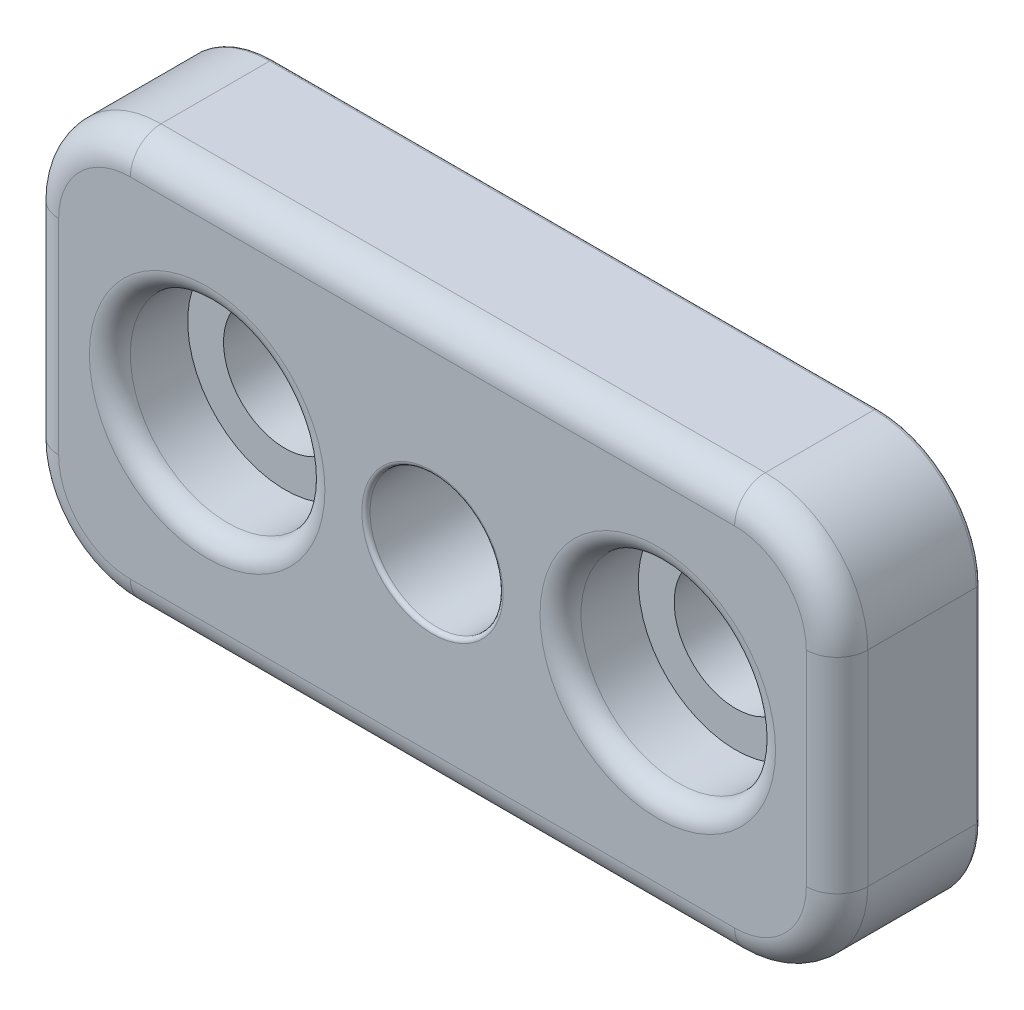
ISO-10303-21;
HEADER;
FILE_DESCRIPTION(('STEP AP214'),'2;1');
FILE_NAME('part.step','',(''),(''),'','','');
FILE_SCHEMA(('AUTOMOTIVE_DESIGN { 1 0 10303 214 1 1 1 1 }'));
ENDSEC;
DATA;
#1=APPLICATION_CONTEXT('core data for automotive mechanical design processes');
#2=APPLICATION_PROTOCOL_DEFINITION('international standard','automotive_design',2000,#1);
#3=PRODUCT_CONTEXT('',#1,'mechanical');
#4=PRODUCT('Part','Part','',(#3));
#5=PRODUCT_RELATED_PRODUCT_CATEGORY('part','',(#4));
#6=PRODUCT_DEFINITION_FORMATION('','',#4);
#7=PRODUCT_DEFINITION_CONTEXT('part definition',#1,'design');
#8=PRODUCT_DEFINITION('design','',#6,#7);
#9=PRODUCT_DEFINITION_SHAPE('','',#8);
#10=(LENGTH_UNIT() NAMED_UNIT(*) SI_UNIT(.MILLI.,.METRE.));
#11=(NAMED_UNIT(*) PLANE_ANGLE_UNIT() SI_UNIT($,.RADIAN.));
#12=(NAMED_UNIT(*) SI_UNIT($,.STERADIAN.) SOLID_ANGLE_UNIT());
#13=UNCERTAINTY_MEASURE_WITH_UNIT(LENGTH_MEASURE(1.E-05),#10,'distance_accuracy_value','');
#14=(GEOMETRIC_REPRESENTATION_CONTEXT(3) GLOBAL_UNCERTAINTY_ASSIGNED_CONTEXT((#13)) GLOBAL_UNIT_ASSIGNED_CONTEXT((#10,
#11,#12)) REPRESENTATION_CONTEXT('',''));
#15=CARTESIAN_POINT('',(0.,0.,0.));
#16=DIRECTION('',(0.,0.,1.));
#17=DIRECTION('',(1.,0.,0.));
#18=AXIS2_PLACEMENT_3D('',#15,#16,#17);
#19=CARTESIAN_POINT('',(11.,0.,3.5));
#20=DIRECTION('',(0.,0.,-1.));
#21=DIRECTION('',(-1.,0.,0.));
#22=AXIS2_PLACEMENT_3D('',#19,#20,#21);
#23=CYLINDRICAL_SURFACE('',#22,3.);
#24=CARTESIAN_POINT('',(11.,0.,-3.3));
#25=DIRECTION('',(0.,0.,1.));
#26=DIRECTION('',(1.,0.,0.));
#27=AXIS2_PLACEMENT_3D('',#24,#25,#26);
#28=CIRCLE('',#27,3.);
#29=CARTESIAN_POINT('',(14.,0.,-3.3));
#30=VERTEX_POINT('',#29);
#31=EDGE_CURVE('E283',#30,#30,#28,.F.);
#32=ORIENTED_EDGE('',*,*,#31,.T.);
#33=EDGE_LOOP('',(#32));
#34=FACE_BOUND('',#33,.T.);
#35=CARTESIAN_POINT('',(11.,0.,-0.299999999999998));
#36=DIRECTION('',(0.,0.,1.));
#37=DIRECTION('',(1.,0.,0.));
#38=AXIS2_PLACEMENT_3D('',#35,#36,#37);
#39=CIRCLE('',#38,3.);
#40=CARTESIAN_POINT('',(14.,0.,-0.299999999999998));
#41=VERTEX_POINT('',#40);
#42=EDGE_CURVE('E790',#41,#41,#39,.F.);
#43=ORIENTED_EDGE('',*,*,#42,.F.);
#44=EDGE_LOOP('',(#43));
#45=FACE_BOUND('',#44,.T.);
#46=ADVANCED_FACE('F57',(#34,#45),#23,.F.);
#47=CARTESIAN_POINT('',(-11.,0.,3.5));
#48=DIRECTION('',(0.,0.,-1.));
#49=DIRECTION('',(-1.,0.,0.));
#50=AXIS2_PLACEMENT_3D('',#47,#48,#49);
#51=CYLINDRICAL_SURFACE('',#50,3.);
#52=CARTESIAN_POINT('',(-11.,0.,-3.3));
#53=DIRECTION('',(0.,0.,1.));
#54=DIRECTION('',(1.,0.,0.));
#55=AXIS2_PLACEMENT_3D('',#52,#53,#54);
#56=CIRCLE('',#55,3.);
#57=CARTESIAN_POINT('',(-8.,0.,-3.3));
#58=VERTEX_POINT('',#57);
#59=EDGE_CURVE('E280',#58,#58,#56,.F.);
#60=ORIENTED_EDGE('',*,*,#59,.T.);
#61=EDGE_LOOP('',(#60));
#62=FACE_BOUND('',#61,.T.);
#63=CARTESIAN_POINT('',(-11.,0.,-0.299999999999998));
#64=DIRECTION('',(0.,0.,1.));
#65=DIRECTION('',(1.,0.,0.));
#66=AXIS2_PLACEMENT_3D('',#63,#64,#65);
#67=CIRCLE('',#66,3.);
#68=CARTESIAN_POINT('',(-8.,0.,-0.299999999999998));
#69=VERTEX_POINT('',#68);
#70=EDGE_CURVE('E789',#69,#69,#67,.F.);
#71=ORIENTED_EDGE('',*,*,#70,.F.);
#72=EDGE_LOOP('',(#71));
#73=FACE_BOUND('',#72,.T.);
#74=ADVANCED_FACE('F444',(#62,#73),#51,.F.);
#75=CARTESIAN_POINT('',(-19.75,0.,3.5));
#76=DIRECTION('',(-1.,0.,0.));
#77=DIRECTION('',(0.,0.,1.));
#78=AXIS2_PLACEMENT_3D('',#75,#76,#77);
#79=PLANE('',#78);
#80=DIRECTION('',(0.,0.,-1.));
#81=VECTOR('',#80,1.);
#82=CARTESIAN_POINT('',(-19.75,5.,-3.5));
#83=LINE('',#82,#81);
#84=CARTESIAN_POINT('',(-19.75,5.,2.));
#85=VERTEX_POINT('',#84);
#86=CARTESIAN_POINT('',(-19.75,5.,-3.3));
#87=VERTEX_POINT('',#86);
#88=EDGE_CURVE('E358',#85,#87,#83,.T.);
#89=ORIENTED_EDGE('',*,*,#88,.T.);
#90=DIRECTION('',(0.,1.,0.));
#91=VECTOR('',#90,1.);
#92=CARTESIAN_POINT('',(-19.75,-5.,-3.3));
#93=LINE('',#92,#91);
#94=CARTESIAN_POINT('',(-19.75,-5.,-3.3));
#95=VERTEX_POINT('',#94);
#96=EDGE_CURVE('E295',#87,#95,#93,.F.);
#97=ORIENTED_EDGE('',*,*,#96,.T.);
#98=DIRECTION('',(0.,0.,-1.));
#99=VECTOR('',#98,1.);
#100=CARTESIAN_POINT('',(-19.75,-5.,3.5));
#101=LINE('',#100,#99);
#102=CARTESIAN_POINT('',(-19.75,-5.,2.));
#103=VERTEX_POINT('',#102);
#104=EDGE_CURVE('E195',#95,#103,#101,.F.);
#105=ORIENTED_EDGE('',*,*,#104,.T.);
#106=DIRECTION('',(0.,1.,0.));
#107=VECTOR('',#106,1.);
#108=CARTESIAN_POINT('',(-19.75,0.,2.));
#109=LINE('',#108,#107);
#110=EDGE_CURVE('E217',#103,#85,#109,.T.);
#111=ORIENTED_EDGE('',*,*,#110,.T.);
#112=EDGE_LOOP('',(#89,#97,#105,#111));
#113=FACE_BOUND('',#112,.T.);
#114=ADVANCED_FACE('F401',(#113),#79,.T.);
#115=CARTESIAN_POINT('',(0.,-10.,3.5));
#116=DIRECTION('',(0.,-1.,0.));
#117=DIRECTION('',(0.,0.,-1.));
#118=AXIS2_PLACEMENT_3D('',#115,#116,#117);
#119=PLANE('',#118);
#120=DIRECTION('',(0.,0.,-1.));
#121=VECTOR('',#120,1.);
#122=CARTESIAN_POINT('',(-14.75,-10.,3.5));
#123=LINE('',#122,#121);
#124=CARTESIAN_POINT('',(-14.75,-10.,2.));
#125=VERTEX_POINT('',#124);
#126=CARTESIAN_POINT('',(-14.75,-10.,-3.3));
#127=VERTEX_POINT('',#126);
#128=EDGE_CURVE('E349',#125,#127,#123,.T.);
#129=ORIENTED_EDGE('',*,*,#128,.T.);
#130=DIRECTION('',(-1.,0.,0.));
#131=VECTOR('',#130,1.);
#132=CARTESIAN_POINT('',(14.75,-10.,-3.3));
#133=LINE('',#132,#131);
#134=CARTESIAN_POINT('',(14.75,-10.,-3.3));
#135=VERTEX_POINT('',#134);
#136=EDGE_CURVE('E299',#127,#135,#133,.F.);
#137=ORIENTED_EDGE('',*,*,#136,.T.);
#138=DIRECTION('',(0.,0.,-1.));
#139=VECTOR('',#138,1.);
#140=CARTESIAN_POINT('',(14.75,-10.,3.5));
#141=LINE('',#140,#139);
#142=CARTESIAN_POINT('',(14.75,-10.,2.));
#143=VERTEX_POINT('',#142);
#144=EDGE_CURVE('E343',#135,#143,#141,.F.);
#145=ORIENTED_EDGE('',*,*,#144,.T.);
#146=DIRECTION('',(-1.,0.,0.));
#147=VECTOR('',#146,1.);
#148=CARTESIAN_POINT('',(0.,-10.,2.));
#149=LINE('',#148,#147);
#150=EDGE_CURVE('E212',#143,#125,#149,.T.);
#151=ORIENTED_EDGE('',*,*,#150,.T.);
#152=EDGE_LOOP('',(#129,#137,#145,#151));
#153=FACE_BOUND('',#152,.T.);
#154=ADVANCED_FACE('F421',(#153),#119,.T.);
#155=CARTESIAN_POINT('',(19.75,0.,3.5));
#156=DIRECTION('',(-1.,0.,0.));
#157=DIRECTION('',(0.,0.,1.));
#158=AXIS2_PLACEMENT_3D('',#155,#156,#157);
#159=PLANE('',#158);
#160=DIRECTION('',(0.,0.,-1.));
#161=VECTOR('',#160,1.);
#162=CARTESIAN_POINT('',(19.75,-5.,-3.5));
#163=LINE('',#162,#161);
#164=CARTESIAN_POINT('',(19.75,-5.,2.));
#165=VERTEX_POINT('',#164);
#166=CARTESIAN_POINT('',(19.75,-5.,-3.3));
#167=VERTEX_POINT('',#166);
#168=EDGE_CURVE('E341',#165,#167,#163,.T.);
#169=ORIENTED_EDGE('',*,*,#168,.T.);
#170=DIRECTION('',(0.,1.,0.));
#171=VECTOR('',#170,1.);
#172=CARTESIAN_POINT('',(19.75,0.,-3.3));
#173=LINE('',#172,#171);
#174=CARTESIAN_POINT('',(19.75,5.,-3.3));
#175=VERTEX_POINT('',#174);
#176=EDGE_CURVE('E82',#167,#175,#173,.T.);
#177=ORIENTED_EDGE('',*,*,#176,.T.);
#178=DIRECTION('',(0.,0.,-1.));
#179=VECTOR('',#178,1.);
#180=CARTESIAN_POINT('',(19.75,5.,3.5));
#181=LINE('',#180,#179);
#182=CARTESIAN_POINT('',(19.75,5.,2.));
#183=VERTEX_POINT('',#182);
#184=EDGE_CURVE('E346',#175,#183,#181,.F.);
#185=ORIENTED_EDGE('',*,*,#184,.T.);
#186=DIRECTION('',(0.,1.,0.));
#187=VECTOR('',#186,1.);
#188=CARTESIAN_POINT('',(19.75,-5.,2.));
#189=LINE('',#188,#187);
#190=EDGE_CURVE('E202',#183,#165,#189,.F.);
#191=ORIENTED_EDGE('',*,*,#190,.T.);
#192=EDGE_LOOP('',(#169,#177,#185,#191));
#193=FACE_BOUND('',#192,.T.);
#194=ADVANCED_FACE('F344',(#193),#159,.F.);
#195=CARTESIAN_POINT('',(0.,0.,3.5));
#196=DIRECTION('',(0.,0.,-1.));
#197=DIRECTION('',(-1.,0.,0.));
#198=AXIS2_PLACEMENT_3D('',#195,#196,#197);
#199=CYLINDRICAL_SURFACE('',#198,3.25);
#200=CARTESIAN_POINT('',(0.,0.,-3.3));
#201=DIRECTION('',(0.,0.,1.));
#202=DIRECTION('',(1.,0.,0.));
#203=AXIS2_PLACEMENT_3D('',#200,#201,#202);
#204=CIRCLE('',#203,3.25);
#205=CARTESIAN_POINT('',(3.25,0.,-3.3));
#206=VERTEX_POINT('',#205);
#207=EDGE_CURVE('E289',#206,#206,#204,.F.);
#208=ORIENTED_EDGE('',*,*,#207,.T.);
#209=EDGE_LOOP('',(#208));
#210=FACE_BOUND('',#209,.T.);
#211=CARTESIAN_POINT('',(0.,0.,3.3));
#212=DIRECTION('',(0.,0.,1.));
#213=DIRECTION('',(1.,0.,0.));
#214=AXIS2_PLACEMENT_3D('',#211,#212,#213);
#215=CIRCLE('',#214,3.25);
#216=CARTESIAN_POINT('',(3.25,0.,3.3));
#217=VERTEX_POINT('',#216);
#218=EDGE_CURVE('E286',#217,#217,#215,.T.);
#219=ORIENTED_EDGE('',*,*,#218,.T.);
#220=EDGE_LOOP('',(#219));
#221=FACE_BOUND('',#220,.T.);
#222=ADVANCED_FACE('F456',(#210,#221),#199,.F.);
#223=CARTESIAN_POINT('',(0.,10.,3.5));
#224=DIRECTION('',(0.,-1.,0.));
#225=DIRECTION('',(0.,0.,-1.));
#226=AXIS2_PLACEMENT_3D('',#223,#224,#225);
#227=PLANE('',#226);
#228=DIRECTION('',(0.,0.,-1.));
#229=VECTOR('',#228,1.);
#230=CARTESIAN_POINT('',(14.75,10.,3.5));
#231=LINE('',#230,#229);
#232=CARTESIAN_POINT('',(14.75,10.,2.));
#233=VERTEX_POINT('',#232);
#234=CARTESIAN_POINT('',(14.75,10.,-3.3));
#235=VERTEX_POINT('',#234);
#236=EDGE_CURVE('E347',#233,#235,#231,.T.);
#237=ORIENTED_EDGE('',*,*,#236,.T.);
#238=DIRECTION('',(-1.,0.,0.));
#239=VECTOR('',#238,1.);
#240=CARTESIAN_POINT('',(0.,10.,-3.3));
#241=LINE('',#240,#239);
#242=CARTESIAN_POINT('',(-14.75,10.,-3.3));
#243=VERTEX_POINT('',#242);
#244=EDGE_CURVE('E66',#235,#243,#241,.T.);
#245=ORIENTED_EDGE('',*,*,#244,.T.);
#246=DIRECTION('',(0.,0.,-1.));
#247=VECTOR('',#246,1.);
#248=CARTESIAN_POINT('',(-14.75,10.,3.5));
#249=LINE('',#248,#247);
#250=CARTESIAN_POINT('',(-14.75,10.,2.));
#251=VERTEX_POINT('',#250);
#252=EDGE_CURVE('E351',#243,#251,#249,.F.);
#253=ORIENTED_EDGE('',*,*,#252,.T.);
#254=DIRECTION('',(-1.,0.,0.));
#255=VECTOR('',#254,1.);
#256=CARTESIAN_POINT('',(14.75,10.,2.));
#257=LINE('',#256,#255);
#258=EDGE_CURVE('E222',#251,#233,#257,.F.);
#259=ORIENTED_EDGE('',*,*,#258,.T.);
#260=EDGE_LOOP('',(#237,#245,#253,#259));
#261=FACE_BOUND('',#260,.T.);
#262=ADVANCED_FACE('F380',(#261),#227,.F.);
#263=CARTESIAN_POINT('',(0.,0.,3.5));
#264=DIRECTION('',(0.,0.,1.));
#265=DIRECTION('',(1.,0.,0.));
#266=AXIS2_PLACEMENT_3D('',#263,#264,#265);
#267=PLANE('',#266);
#268=CARTESIAN_POINT('',(0.,0.,3.5));
#269=DIRECTION('',(0.,0.,1.));
#270=DIRECTION('',(1.,0.,0.));
#271=AXIS2_PLACEMENT_3D('',#268,#269,#270);
#272=CIRCLE('',#271,3.45);
#273=CARTESIAN_POINT('',(3.45,0.,3.5));
#274=VERTEX_POINT('',#273);
#275=EDGE_CURVE('E13',#274,#274,#272,.F.);
#276=ORIENTED_EDGE('',*,*,#275,.T.);
#277=EDGE_LOOP('',(#276));
#278=FACE_BOUND('',#277,.T.);
#279=CARTESIAN_POINT('',(11.,0.,3.5));
#280=DIRECTION('',(0.,0.,1.));
#281=DIRECTION('',(1.,0.,0.));
#282=AXIS2_PLACEMENT_3D('',#279,#280,#281);
#283=CIRCLE('',#282,5.75);
#284=CARTESIAN_POINT('',(16.75,0.,3.5));
#285=VERTEX_POINT('',#284);
#286=EDGE_CURVE('E248',#285,#285,#283,.F.);
#287=ORIENTED_EDGE('',*,*,#286,.T.);
#288=EDGE_LOOP('',(#287));
#289=FACE_BOUND('',#288,.T.);
#290=CARTESIAN_POINT('',(-11.,0.,3.5));
#291=DIRECTION('',(0.,0.,1.));
#292=DIRECTION('',(1.,0.,0.));
#293=AXIS2_PLACEMENT_3D('',#290,#291,#292);
#294=CIRCLE('',#293,5.75);
#295=CARTESIAN_POINT('',(-5.25,0.,3.5));
#296=VERTEX_POINT('',#295);
#297=EDGE_CURVE('E245',#296,#296,#294,.F.);
#298=ORIENTED_EDGE('',*,*,#297,.T.);
#299=EDGE_LOOP('',(#298));
#300=FACE_BOUND('',#299,.T.);
#301=DIRECTION('',(0.,1.,0.));
#302=VECTOR('',#301,1.);
#303=CARTESIAN_POINT('',(18.25,5.,3.5));
#304=LINE('',#303,#302);
#305=CARTESIAN_POINT('',(18.25,-5.,3.5));
#306=VERTEX_POINT('',#305);
#307=CARTESIAN_POINT('',(18.25,5.,3.5));
#308=VERTEX_POINT('',#307);
#309=EDGE_CURVE('E199',#306,#308,#304,.T.);
#310=ORIENTED_EDGE('',*,*,#309,.T.);
#311=CARTESIAN_POINT('',(14.75,5.,3.5));
#312=DIRECTION('',(0.,0.,1.));
#313=DIRECTION('',(1.,0.,0.));
#314=AXIS2_PLACEMENT_3D('',#311,#312,#313);
#315=CIRCLE('',#314,3.5);
#316=CARTESIAN_POINT('',(14.75,8.5,3.5));
#317=VERTEX_POINT('',#316);
#318=EDGE_CURVE('E180',#308,#317,#315,.T.);
#319=ORIENTED_EDGE('',*,*,#318,.T.);
#320=DIRECTION('',(-1.,0.,0.));
#321=VECTOR('',#320,1.);
#322=CARTESIAN_POINT('',(-14.75,8.5,3.5));
#323=LINE('',#322,#321);
#324=CARTESIAN_POINT('',(-14.75,8.5,3.5));
#325=VERTEX_POINT('',#324);
#326=EDGE_CURVE('E188',#317,#325,#323,.T.);
#327=ORIENTED_EDGE('',*,*,#326,.T.);
#328=CARTESIAN_POINT('',(-14.75,5.,3.5));
#329=DIRECTION('',(0.,0.,1.));
#330=DIRECTION('',(1.,0.,0.));
#331=AXIS2_PLACEMENT_3D('',#328,#329,#330);
#332=CIRCLE('',#331,3.5);
#333=CARTESIAN_POINT('',(-18.25,5.,3.5));
#334=VERTEX_POINT('',#333);
#335=EDGE_CURVE('E194',#325,#334,#332,.T.);
#336=ORIENTED_EDGE('',*,*,#335,.T.);
#337=DIRECTION('',(0.,1.,0.));
#338=VECTOR('',#337,1.);
#339=CARTESIAN_POINT('',(-18.25,0.,3.5));
#340=LINE('',#339,#338);
#341=CARTESIAN_POINT('',(-18.25,-5.,3.5));
#342=VERTEX_POINT('',#341);
#343=EDGE_CURVE('E363',#334,#342,#340,.F.);
#344=ORIENTED_EDGE('',*,*,#343,.T.);
#345=CARTESIAN_POINT('',(-14.75,-5.,3.5));
#346=DIRECTION('',(0.,0.,1.));
#347=DIRECTION('',(1.,0.,0.));
#348=AXIS2_PLACEMENT_3D('',#345,#346,#347);
#349=CIRCLE('',#348,3.5);
#350=CARTESIAN_POINT('',(-14.75,-8.5,3.5));
#351=VERTEX_POINT('',#350);
#352=EDGE_CURVE('E365',#342,#351,#349,.T.);
#353=ORIENTED_EDGE('',*,*,#352,.T.);
#354=DIRECTION('',(-1.,0.,0.));
#355=VECTOR('',#354,1.);
#356=CARTESIAN_POINT('',(0.,-8.5,3.5));
#357=LINE('',#356,#355);
#358=CARTESIAN_POINT('',(14.75,-8.5,3.5));
#359=VERTEX_POINT('',#358);
#360=EDGE_CURVE('E367',#351,#359,#357,.F.);
#361=ORIENTED_EDGE('',*,*,#360,.T.);
#362=CARTESIAN_POINT('',(14.75,-5.,3.5));
#363=DIRECTION('',(0.,0.,1.));
#364=DIRECTION('',(1.,0.,0.));
#365=AXIS2_PLACEMENT_3D('',#362,#363,#364);
#366=CIRCLE('',#365,3.5);
#367=EDGE_CURVE('E204',#359,#306,#366,.T.);
#368=ORIENTED_EDGE('',*,*,#367,.T.);
#369=EDGE_LOOP('',(#310,#319,#327,#336,#344,#353,#361,#368));
#370=FACE_BOUND('',#369,.T.);
#371=ADVANCED_FACE('F197',(#278,#289,#300,#370),#267,.T.);
#372=CARTESIAN_POINT('',(0.,0.,-3.5));
#373=DIRECTION('',(0.,0.,1.));
#374=DIRECTION('',(1.,0.,0.));
#375=AXIS2_PLACEMENT_3D('',#372,#373,#374);
#376=PLANE('',#375);
#377=CARTESIAN_POINT('',(-11.,0.,-3.5));
#378=DIRECTION('',(0.,0.,1.));
#379=DIRECTION('',(1.,0.,0.));
#380=AXIS2_PLACEMENT_3D('',#377,#378,#379);
#381=CIRCLE('',#380,3.2);
#382=CARTESIAN_POINT('',(-7.8,0.,-3.5));
#383=VERTEX_POINT('',#382);
#384=EDGE_CURVE('E277',#383,#383,#381,.T.);
#385=ORIENTED_EDGE('',*,*,#384,.T.);
#386=EDGE_LOOP('',(#385));
#387=FACE_BOUND('',#386,.T.);
#388=CARTESIAN_POINT('',(11.,0.,-3.5));
#389=DIRECTION('',(0.,0.,1.));
#390=DIRECTION('',(1.,0.,0.));
#391=AXIS2_PLACEMENT_3D('',#388,#389,#390);
#392=CIRCLE('',#391,3.2);
#393=CARTESIAN_POINT('',(14.2,0.,-3.5));
#394=VERTEX_POINT('',#393);
#395=EDGE_CURVE('E274',#394,#394,#392,.T.);
#396=ORIENTED_EDGE('',*,*,#395,.T.);
#397=EDGE_LOOP('',(#396));
#398=FACE_BOUND('',#397,.T.);
#399=CARTESIAN_POINT('',(0.,0.,-3.5));
#400=DIRECTION('',(0.,0.,1.));
#401=DIRECTION('',(1.,0.,0.));
#402=AXIS2_PLACEMENT_3D('',#399,#400,#401);
#403=CIRCLE('',#402,3.45);
#404=CARTESIAN_POINT('',(3.45,0.,-3.5));
#405=VERTEX_POINT('',#404);
#406=EDGE_CURVE('E271',#405,#405,#403,.T.);
#407=ORIENTED_EDGE('',*,*,#406,.T.);
#408=EDGE_LOOP('',(#407));
#409=FACE_BOUND('',#408,.T.);
#410=DIRECTION('',(0.,1.,0.));
#411=VECTOR('',#410,1.);
#412=CARTESIAN_POINT('',(-19.55,5.,-3.5));
#413=LINE('',#412,#411);
#414=CARTESIAN_POINT('',(-19.55,-5.,-3.5));
#415=VERTEX_POINT('',#414);
#416=CARTESIAN_POINT('',(-19.55,5.,-3.5));
#417=VERTEX_POINT('',#416);
#418=EDGE_CURVE('E266',#415,#417,#413,.T.);
#419=ORIENTED_EDGE('',*,*,#418,.T.);
#420=CARTESIAN_POINT('',(-14.75,5.,-3.5));
#421=DIRECTION('',(0.,0.,1.));
#422=DIRECTION('',(1.,0.,0.));
#423=AXIS2_PLACEMENT_3D('',#420,#421,#422);
#424=CIRCLE('',#423,4.8);
#425=CARTESIAN_POINT('',(-14.75,9.8,-3.5));
#426=VERTEX_POINT('',#425);
#427=EDGE_CURVE('E268',#417,#426,#424,.F.);
#428=ORIENTED_EDGE('',*,*,#427,.T.);
#429=DIRECTION('',(-1.,0.,0.));
#430=VECTOR('',#429,1.);
#431=CARTESIAN_POINT('',(0.,9.8,-3.5));
#432=LINE('',#431,#430);
#433=CARTESIAN_POINT('',(14.75,9.8,-3.5));
#434=VERTEX_POINT('',#433);
#435=EDGE_CURVE('E254',#426,#434,#432,.F.);
#436=ORIENTED_EDGE('',*,*,#435,.T.);
#437=CARTESIAN_POINT('',(14.75,5.,-3.5));
#438=DIRECTION('',(0.,0.,1.));
#439=DIRECTION('',(1.,0.,0.));
#440=AXIS2_PLACEMENT_3D('',#437,#438,#439);
#441=CIRCLE('',#440,4.8);
#442=CARTESIAN_POINT('',(19.55,5.,-3.5));
#443=VERTEX_POINT('',#442);
#444=EDGE_CURVE('E256',#434,#443,#441,.F.);
#445=ORIENTED_EDGE('',*,*,#444,.T.);
#446=DIRECTION('',(0.,1.,0.));
#447=VECTOR('',#446,1.);
#448=CARTESIAN_POINT('',(19.55,0.,-3.5));
#449=LINE('',#448,#447);
#450=CARTESIAN_POINT('',(19.55,-5.,-3.5));
#451=VERTEX_POINT('',#450);
#452=EDGE_CURVE('E258',#443,#451,#449,.F.);
#453=ORIENTED_EDGE('',*,*,#452,.T.);
#454=CARTESIAN_POINT('',(14.75,-5.,-3.5));
#455=DIRECTION('',(0.,0.,1.));
#456=DIRECTION('',(1.,0.,0.));
#457=AXIS2_PLACEMENT_3D('',#454,#455,#456);
#458=CIRCLE('',#457,4.8);
#459=CARTESIAN_POINT('',(14.75,-9.8,-3.5));
#460=VERTEX_POINT('',#459);
#461=EDGE_CURVE('E260',#451,#460,#458,.F.);
#462=ORIENTED_EDGE('',*,*,#461,.T.);
#463=DIRECTION('',(-1.,0.,0.));
#464=VECTOR('',#463,1.);
#465=CARTESIAN_POINT('',(-14.75,-9.8,-3.5));
#466=LINE('',#465,#464);
#467=CARTESIAN_POINT('',(-14.75,-9.8,-3.5));
#468=VERTEX_POINT('',#467);
#469=EDGE_CURVE('E262',#460,#468,#466,.T.);
#470=ORIENTED_EDGE('',*,*,#469,.T.);
#471=CARTESIAN_POINT('',(-14.75,-5.,-3.5));
#472=DIRECTION('',(0.,0.,1.));
#473=DIRECTION('',(1.,0.,0.));
#474=AXIS2_PLACEMENT_3D('',#471,#472,#473);
#475=CIRCLE('',#474,4.8);
#476=EDGE_CURVE('E264',#468,#415,#475,.F.);
#477=ORIENTED_EDGE('',*,*,#476,.T.);
#478=EDGE_LOOP('',(#419,#428,#436,#445,#453,#462,#470,#477));
#479=FACE_BOUND('',#478,.T.);
#480=ADVANCED_FACE('F433',(#387,#398,#409,#479),#376,.F.);
#481=CARTESIAN_POINT('',(11.,0.,-16.9350288425444));
#482=DIRECTION('',(0.,0.,1.));
#483=DIRECTION('',(1.,0.,0.));
#484=AXIS2_PLACEMENT_3D('',#481,#482,#483);
#485=CYLINDRICAL_SURFACE('',#484,4.75);
#486=CARTESIAN_POINT('',(11.,0.,2.5));
#487=DIRECTION('',(0.,0.,1.));
#488=DIRECTION('',(1.,0.,0.));
#489=AXIS2_PLACEMENT_3D('',#486,#487,#488);
#490=CIRCLE('',#489,4.75);
#491=CARTESIAN_POINT('',(15.75,0.,2.5));
#492=VERTEX_POINT('',#491);
#493=EDGE_CURVE('E223',#492,#492,#490,.T.);
#494=ORIENTED_EDGE('',*,*,#493,.T.);
#495=EDGE_LOOP('',(#494));
#496=FACE_BOUND('',#495,.T.);
#497=CARTESIAN_POINT('',(11.,0.,-0.299999999999998));
#498=DIRECTION('',(0.,0.,1.));
#499=DIRECTION('',(1.,0.,0.));
#500=AXIS2_PLACEMENT_3D('',#497,#498,#499);
#501=CIRCLE('',#500,4.75);
#502=CARTESIAN_POINT('',(15.75,0.,-0.299999999999998));
#503=VERTEX_POINT('',#502);
#504=EDGE_CURVE('E242',#503,#503,#501,.F.);
#505=ORIENTED_EDGE('',*,*,#504,.T.);
#506=EDGE_LOOP('',(#505));
#507=FACE_BOUND('',#506,.T.);
#508=ADVANCED_FACE('F688',(#496,#507),#485,.F.);
#509=CARTESIAN_POINT('',(0.,0.,-0.3));
#510=DIRECTION('',(0.,0.,1.));
#511=DIRECTION('',(1.,0.,0.));
#512=AXIS2_PLACEMENT_3D('',#509,#510,#511);
#513=PLANE('',#512);
#514=ORIENTED_EDGE('',*,*,#504,.F.);
#515=EDGE_LOOP('',(#514));
#516=FACE_BOUND('',#515,.T.);
#517=ORIENTED_EDGE('',*,*,#42,.T.);
#518=EDGE_LOOP('',(#517));
#519=FACE_BOUND('',#518,.T.);
#520=ADVANCED_FACE('F679',(#516,#519),#513,.T.);
#521=CARTESIAN_POINT('',(-11.,0.,-16.9350288425444));
#522=DIRECTION('',(0.,0.,1.));
#523=DIRECTION('',(1.,0.,0.));
#524=AXIS2_PLACEMENT_3D('',#521,#522,#523);
#525=CYLINDRICAL_SURFACE('',#524,4.75);
#526=CARTESIAN_POINT('',(-11.,0.,2.5));
#527=DIRECTION('',(0.,0.,1.));
#528=DIRECTION('',(1.,0.,0.));
#529=AXIS2_PLACEMENT_3D('',#526,#527,#528);
#530=CIRCLE('',#529,4.75);
#531=CARTESIAN_POINT('',(-6.25,0.,2.5));
#532=VERTEX_POINT('',#531);
#533=EDGE_CURVE('E251',#532,#532,#530,.T.);
#534=ORIENTED_EDGE('',*,*,#533,.T.);
#535=EDGE_LOOP('',(#534));
#536=FACE_BOUND('',#535,.T.);
#537=CARTESIAN_POINT('',(-11.,0.,-0.299999999999998));
#538=DIRECTION('',(0.,0.,1.));
#539=DIRECTION('',(1.,0.,0.));
#540=AXIS2_PLACEMENT_3D('',#537,#538,#539);
#541=CIRCLE('',#540,4.75);
#542=CARTESIAN_POINT('',(-6.25,0.,-0.299999999999998));
#543=VERTEX_POINT('',#542);
#544=EDGE_CURVE('E788',#543,#543,#541,.F.);
#545=ORIENTED_EDGE('',*,*,#544,.T.);
#546=EDGE_LOOP('',(#545));
#547=FACE_BOUND('',#546,.T.);
#548=ADVANCED_FACE('F670',(#536,#547),#525,.F.);
#549=CARTESIAN_POINT('',(0.,0.,-0.3));
#550=DIRECTION('',(0.,0.,1.));
#551=DIRECTION('',(1.,0.,0.));
#552=AXIS2_PLACEMENT_3D('',#549,#550,#551);
#553=PLANE('',#552);
#554=ORIENTED_EDGE('',*,*,#544,.F.);
#555=EDGE_LOOP('',(#554));
#556=FACE_BOUND('',#555,.T.);
#557=ORIENTED_EDGE('',*,*,#70,.T.);
#558=EDGE_LOOP('',(#557));
#559=FACE_BOUND('',#558,.T.);
#560=ADVANCED_FACE('F470',(#556,#559),#553,.T.);
#561=CARTESIAN_POINT('',(14.75,5.,3.5));
#562=DIRECTION('',(0.,0.,-1.));
#563=DIRECTION('',(-1.,0.,0.));
#564=AXIS2_PLACEMENT_3D('',#561,#562,#563);
#565=CYLINDRICAL_SURFACE('',#564,5.);
#566=ORIENTED_EDGE('',*,*,#184,.F.);
#567=CARTESIAN_POINT('',(14.75,5.,-3.3));
#568=DIRECTION('',(0.,0.,1.));
#569=DIRECTION('',(1.,0.,0.));
#570=AXIS2_PLACEMENT_3D('',#567,#568,#569);
#571=CIRCLE('',#570,5.);
#572=EDGE_CURVE('E74',#175,#235,#571,.T.);
#573=ORIENTED_EDGE('',*,*,#572,.T.);
#574=ORIENTED_EDGE('',*,*,#236,.F.);
#575=CARTESIAN_POINT('',(14.75,5.,2.));
#576=DIRECTION('',(0.,0.,1.));
#577=DIRECTION('',(1.,0.,0.));
#578=AXIS2_PLACEMENT_3D('',#575,#576,#577);
#579=CIRCLE('',#578,5.);
#580=EDGE_CURVE('E182',#233,#183,#579,.F.);
#581=ORIENTED_EDGE('',*,*,#580,.T.);
#582=EDGE_LOOP('',(#566,#573,#574,#581));
#583=FACE_BOUND('',#582,.T.);
#584=ADVANCED_FACE('F376',(#583),#565,.T.);
#585=CARTESIAN_POINT('',(14.75,-5.,3.5));
#586=DIRECTION('',(0.,0.,1.));
#587=DIRECTION('',(1.,0.,0.));
#588=AXIS2_PLACEMENT_3D('',#585,#586,#587);
#589=CYLINDRICAL_SURFACE('',#588,5.);
#590=ORIENTED_EDGE('',*,*,#144,.F.);
#591=CARTESIAN_POINT('',(14.75,-5.,-3.3));
#592=DIRECTION('',(0.,0.,1.));
#593=DIRECTION('',(1.,0.,0.));
#594=AXIS2_PLACEMENT_3D('',#591,#592,#593);
#595=CIRCLE('',#594,5.);
#596=EDGE_CURVE('E301',#135,#167,#595,.T.);
#597=ORIENTED_EDGE('',*,*,#596,.T.);
#598=ORIENTED_EDGE('',*,*,#168,.F.);
#599=CARTESIAN_POINT('',(14.75,-5.,2.));
#600=DIRECTION('',(0.,0.,1.));
#601=DIRECTION('',(1.,0.,0.));
#602=AXIS2_PLACEMENT_3D('',#599,#600,#601);
#603=CIRCLE('',#602,5.);
#604=EDGE_CURVE('E209',#165,#143,#603,.F.);
#605=ORIENTED_EDGE('',*,*,#604,.T.);
#606=EDGE_LOOP('',(#590,#597,#598,#605));
#607=FACE_BOUND('',#606,.T.);
#608=ADVANCED_FACE('F340',(#607),#589,.T.);
#609=CARTESIAN_POINT('',(-14.75,-5.,3.5));
#610=DIRECTION('',(0.,0.,-1.));
#611=DIRECTION('',(-1.,0.,0.));
#612=AXIS2_PLACEMENT_3D('',#609,#610,#611);
#613=CYLINDRICAL_SURFACE('',#612,5.);
#614=ORIENTED_EDGE('',*,*,#104,.F.);
#615=CARTESIAN_POINT('',(-14.75,-5.,-3.3));
#616=DIRECTION('',(0.,0.,1.));
#617=DIRECTION('',(1.,0.,0.));
#618=AXIS2_PLACEMENT_3D('',#615,#616,#617);
#619=CIRCLE('',#618,5.);
#620=EDGE_CURVE('E297',#95,#127,#619,.T.);
#621=ORIENTED_EDGE('',*,*,#620,.T.);
#622=ORIENTED_EDGE('',*,*,#128,.F.);
#623=CARTESIAN_POINT('',(-14.75,-5.,2.));
#624=DIRECTION('',(0.,0.,1.));
#625=DIRECTION('',(1.,0.,0.));
#626=AXIS2_PLACEMENT_3D('',#623,#624,#625);
#627=CIRCLE('',#626,5.);
#628=EDGE_CURVE('E214',#125,#103,#627,.F.);
#629=ORIENTED_EDGE('',*,*,#628,.T.);
#630=EDGE_LOOP('',(#614,#621,#622,#629));
#631=FACE_BOUND('',#630,.T.);
#632=ADVANCED_FACE('F423',(#631),#613,.T.);
#633=CARTESIAN_POINT('',(-14.75,5.,3.5));
#634=DIRECTION('',(0.,0.,1.));
#635=DIRECTION('',(1.,0.,0.));
#636=AXIS2_PLACEMENT_3D('',#633,#634,#635);
#637=CYLINDRICAL_SURFACE('',#636,5.);
#638=ORIENTED_EDGE('',*,*,#252,.F.);
#639=CARTESIAN_POINT('',(-14.75,5.,-3.3));
#640=DIRECTION('',(0.,0.,1.));
#641=DIRECTION('',(1.,0.,0.));
#642=AXIS2_PLACEMENT_3D('',#639,#640,#641);
#643=CIRCLE('',#642,5.);
#644=EDGE_CURVE('E292',#243,#87,#643,.T.);
#645=ORIENTED_EDGE('',*,*,#644,.T.);
#646=ORIENTED_EDGE('',*,*,#88,.F.);
#647=CARTESIAN_POINT('',(-14.75,5.,2.));
#648=DIRECTION('',(0.,0.,1.));
#649=DIRECTION('',(1.,0.,0.));
#650=AXIS2_PLACEMENT_3D('',#647,#648,#649);
#651=CIRCLE('',#650,5.);
#652=EDGE_CURVE('E219',#85,#251,#651,.F.);
#653=ORIENTED_EDGE('',*,*,#652,.T.);
#654=EDGE_LOOP('',(#638,#645,#646,#653));
#655=FACE_BOUND('',#654,.T.);
#656=ADVANCED_FACE('F398',(#655),#637,.T.);
#657=CARTESIAN_POINT('',(-14.75,-5.,2.));
#658=DIRECTION('',(0.,0.,1.));
#659=DIRECTION('',(1.,0.,0.));
#660=AXIS2_PLACEMENT_3D('',#657,#658,#659);
#661=TOROIDAL_SURFACE('',#660,3.5,1.5);
#662=CARTESIAN_POINT('',(-18.25,-5.,2.));
#663=DIRECTION('',(0.,1.,0.));
#664=DIRECTION('',(0.,0.,1.));
#665=AXIS2_PLACEMENT_3D('',#662,#663,#664);
#666=CIRCLE('',#665,1.5);
#667=EDGE_CURVE('E236',#103,#342,#666,.T.);
#668=ORIENTED_EDGE('',*,*,#667,.F.);
#669=ORIENTED_EDGE('',*,*,#628,.F.);
#670=CARTESIAN_POINT('',(-14.75,-8.5,2.));
#671=DIRECTION('',(1.,0.,0.));
#672=DIRECTION('',(0.,0.,-1.));
#673=AXIS2_PLACEMENT_3D('',#670,#671,#672);
#674=CIRCLE('',#673,1.5);
#675=EDGE_CURVE('E239',#351,#125,#674,.T.);
#676=ORIENTED_EDGE('',*,*,#675,.F.);
#677=ORIENTED_EDGE('',*,*,#352,.F.);
#678=EDGE_LOOP('',(#668,#669,#676,#677));
#679=FACE_BOUND('',#678,.T.);
#680=ADVANCED_FACE('F414',(#679),#661,.T.);
#681=CARTESIAN_POINT('',(0.,-8.5,2.));
#682=DIRECTION('',(-1.,0.,0.));
#683=DIRECTION('',(0.,0.,1.));
#684=AXIS2_PLACEMENT_3D('',#681,#682,#683);
#685=CYLINDRICAL_SURFACE('',#684,1.5);
#686=ORIENTED_EDGE('',*,*,#675,.T.);
#687=ORIENTED_EDGE('',*,*,#150,.F.);
#688=CARTESIAN_POINT('',(14.75,-8.5,2.));
#689=DIRECTION('',(1.,0.,0.));
#690=DIRECTION('',(0.,0.,-1.));
#691=AXIS2_PLACEMENT_3D('',#688,#689,#690);
#692=CIRCLE('',#691,1.5);
#693=EDGE_CURVE('E233',#359,#143,#692,.T.);
#694=ORIENTED_EDGE('',*,*,#693,.F.);
#695=ORIENTED_EDGE('',*,*,#360,.F.);
#696=EDGE_LOOP('',(#686,#687,#694,#695));
#697=FACE_BOUND('',#696,.T.);
#698=ADVANCED_FACE('F418',(#697),#685,.T.);
#699=CARTESIAN_POINT('',(-18.25,0.,2.));
#700=DIRECTION('',(0.,1.,0.));
#701=DIRECTION('',(0.,0.,1.));
#702=AXIS2_PLACEMENT_3D('',#699,#700,#701);
#703=CYLINDRICAL_SURFACE('',#702,1.5);
#704=ORIENTED_EDGE('',*,*,#667,.T.);
#705=ORIENTED_EDGE('',*,*,#343,.F.);
#706=CARTESIAN_POINT('',(-18.25,5.,2.));
#707=DIRECTION('',(0.,1.,0.));
#708=DIRECTION('',(0.,0.,1.));
#709=AXIS2_PLACEMENT_3D('',#706,#707,#708);
#710=CIRCLE('',#709,1.5);
#711=EDGE_CURVE('E230',#85,#334,#710,.T.);
#712=ORIENTED_EDGE('',*,*,#711,.F.);
#713=ORIENTED_EDGE('',*,*,#110,.F.);
#714=EDGE_LOOP('',(#704,#705,#712,#713));
#715=FACE_BOUND('',#714,.T.);
#716=ADVANCED_FACE('F405',(#715),#703,.T.);
#717=CARTESIAN_POINT('',(14.75,-5.,2.));
#718=DIRECTION('',(0.,0.,1.));
#719=DIRECTION('',(1.,0.,0.));
#720=AXIS2_PLACEMENT_3D('',#717,#718,#719);
#721=TOROIDAL_SURFACE('',#720,3.5,1.5);
#722=ORIENTED_EDGE('',*,*,#693,.T.);
#723=ORIENTED_EDGE('',*,*,#604,.F.);
#724=CARTESIAN_POINT('',(18.25,-5.,2.));
#725=DIRECTION('',(0.,1.,0.));
#726=DIRECTION('',(0.,0.,1.));
#727=AXIS2_PLACEMENT_3D('',#724,#725,#726);
#728=CIRCLE('',#727,1.5);
#729=EDGE_CURVE('E227',#306,#165,#728,.T.);
#730=ORIENTED_EDGE('',*,*,#729,.F.);
#731=ORIENTED_EDGE('',*,*,#367,.F.);
#732=EDGE_LOOP('',(#722,#723,#730,#731));
#733=FACE_BOUND('',#732,.T.);
#734=ADVANCED_FACE('F373',(#733),#721,.T.);
#735=CARTESIAN_POINT('',(-14.75,5.,2.));
#736=DIRECTION('',(0.,0.,1.));
#737=DIRECTION('',(1.,0.,0.));
#738=AXIS2_PLACEMENT_3D('',#735,#736,#737);
#739=TOROIDAL_SURFACE('',#738,3.5,1.5);
#740=ORIENTED_EDGE('',*,*,#711,.T.);
#741=ORIENTED_EDGE('',*,*,#335,.F.);
#742=CARTESIAN_POINT('',(-14.75,8.5,2.));
#743=DIRECTION('',(1.,0.,0.));
#744=DIRECTION('',(0.,0.,-1.));
#745=AXIS2_PLACEMENT_3D('',#742,#743,#744);
#746=CIRCLE('',#745,1.5);
#747=EDGE_CURVE('E191',#251,#325,#746,.T.);
#748=ORIENTED_EDGE('',*,*,#747,.F.);
#749=ORIENTED_EDGE('',*,*,#652,.F.);
#750=EDGE_LOOP('',(#740,#741,#748,#749));
#751=FACE_BOUND('',#750,.T.);
#752=ADVANCED_FACE('F410',(#751),#739,.T.);
#753=CARTESIAN_POINT('',(18.25,0.,2.));
#754=DIRECTION('',(0.,-1.,0.));
#755=DIRECTION('',(0.,0.,-1.));
#756=AXIS2_PLACEMENT_3D('',#753,#754,#755);
#757=CYLINDRICAL_SURFACE('',#756,1.5);
#758=ORIENTED_EDGE('',*,*,#729,.T.);
#759=ORIENTED_EDGE('',*,*,#190,.F.);
#760=CARTESIAN_POINT('',(18.25,5.,2.));
#761=DIRECTION('',(0.,1.,0.));
#762=DIRECTION('',(0.,0.,1.));
#763=AXIS2_PLACEMENT_3D('',#760,#761,#762);
#764=CIRCLE('',#763,1.5);
#765=EDGE_CURVE('E185',#308,#183,#764,.T.);
#766=ORIENTED_EDGE('',*,*,#765,.F.);
#767=ORIENTED_EDGE('',*,*,#309,.F.);
#768=EDGE_LOOP('',(#758,#759,#766,#767));
#769=FACE_BOUND('',#768,.T.);
#770=ADVANCED_FACE('F375',(#769),#757,.T.);
#771=CARTESIAN_POINT('',(0.,8.5,2.));
#772=DIRECTION('',(1.,0.,0.));
#773=DIRECTION('',(0.,0.,-1.));
#774=AXIS2_PLACEMENT_3D('',#771,#772,#773);
#775=CYLINDRICAL_SURFACE('',#774,1.5);
#776=ORIENTED_EDGE('',*,*,#747,.T.);
#777=ORIENTED_EDGE('',*,*,#326,.F.);
#778=CARTESIAN_POINT('',(14.75,8.5,2.));
#779=DIRECTION('',(1.,0.,0.));
#780=DIRECTION('',(0.,0.,-1.));
#781=AXIS2_PLACEMENT_3D('',#778,#779,#780);
#782=CIRCLE('',#781,1.5);
#783=EDGE_CURVE('E175',#233,#317,#782,.T.);
#784=ORIENTED_EDGE('',*,*,#783,.F.);
#785=ORIENTED_EDGE('',*,*,#258,.F.);
#786=EDGE_LOOP('',(#776,#777,#784,#785));
#787=FACE_BOUND('',#786,.T.);
#788=ADVANCED_FACE('F189',(#787),#775,.T.);
#789=CARTESIAN_POINT('',(14.75,5.,2.));
#790=DIRECTION('',(0.,0.,1.));
#791=DIRECTION('',(1.,0.,0.));
#792=AXIS2_PLACEMENT_3D('',#789,#790,#791);
#793=TOROIDAL_SURFACE('',#792,3.5,1.5);
#794=ORIENTED_EDGE('',*,*,#765,.T.);
#795=ORIENTED_EDGE('',*,*,#580,.F.);
#796=ORIENTED_EDGE('',*,*,#783,.T.);
#797=ORIENTED_EDGE('',*,*,#318,.F.);
#798=EDGE_LOOP('',(#794,#795,#796,#797));
#799=FACE_BOUND('',#798,.T.);
#800=ADVANCED_FACE('F178',(#799),#793,.T.);
#801=CARTESIAN_POINT('',(11.,0.,2.5));
#802=DIRECTION('',(0.,0.,1.));
#803=DIRECTION('',(1.,0.,0.));
#804=AXIS2_PLACEMENT_3D('',#801,#802,#803);
#805=TOROIDAL_SURFACE('',#804,5.75,1.);
#806=ORIENTED_EDGE('',*,*,#286,.F.);
#807=EDGE_LOOP('',(#806));
#808=FACE_BOUND('',#807,.T.);
#809=ORIENTED_EDGE('',*,*,#493,.F.);
#810=EDGE_LOOP('',(#809));
#811=FACE_BOUND('',#810,.T.);
#812=ADVANCED_FACE('F479',(#808,#811),#805,.T.);
#813=CARTESIAN_POINT('',(-11.,0.,2.5));
#814=DIRECTION('',(0.,0.,1.));
#815=DIRECTION('',(1.,0.,0.));
#816=AXIS2_PLACEMENT_3D('',#813,#814,#815);
#817=TOROIDAL_SURFACE('',#816,5.75,1.);
#818=ORIENTED_EDGE('',*,*,#297,.F.);
#819=EDGE_LOOP('',(#818));
#820=FACE_BOUND('',#819,.T.);
#821=ORIENTED_EDGE('',*,*,#533,.F.);
#822=EDGE_LOOP('',(#821));
#823=FACE_BOUND('',#822,.T.);
#824=ADVANCED_FACE('F496',(#820,#823),#817,.T.);
#825=CARTESIAN_POINT('',(-11.,0.,-3.3));
#826=DIRECTION('',(0.,0.,1.));
#827=DIRECTION('',(1.,0.,0.));
#828=AXIS2_PLACEMENT_3D('',#825,#826,#827);
#829=TOROIDAL_SURFACE('',#828,3.2,0.2);
#830=ORIENTED_EDGE('',*,*,#59,.F.);
#831=EDGE_LOOP('',(#830));
#832=FACE_BOUND('',#831,.T.);
#833=ORIENTED_EDGE('',*,*,#384,.F.);
#834=EDGE_LOOP('',(#833));
#835=FACE_BOUND('',#834,.T.);
#836=ADVANCED_FACE('F499',(#832,#835),#829,.T.);
#837=CARTESIAN_POINT('',(11.,0.,-3.3));
#838=DIRECTION('',(0.,0.,1.));
#839=DIRECTION('',(1.,0.,0.));
#840=AXIS2_PLACEMENT_3D('',#837,#838,#839);
#841=TOROIDAL_SURFACE('',#840,3.2,0.2);
#842=ORIENTED_EDGE('',*,*,#395,.F.);
#843=EDGE_LOOP('',(#842));
#844=FACE_BOUND('',#843,.T.);
#845=ORIENTED_EDGE('',*,*,#31,.F.);
#846=EDGE_LOOP('',(#845));
#847=FACE_BOUND('',#846,.T.);
#848=ADVANCED_FACE('F503',(#844,#847),#841,.T.);
#849=CARTESIAN_POINT('',(0.,0.,-3.3));
#850=DIRECTION('',(0.,0.,1.));
#851=DIRECTION('',(1.,0.,0.));
#852=AXIS2_PLACEMENT_3D('',#849,#850,#851);
#853=TOROIDAL_SURFACE('',#852,3.45,0.2);
#854=ORIENTED_EDGE('',*,*,#207,.F.);
#855=EDGE_LOOP('',(#854));
#856=FACE_BOUND('',#855,.T.);
#857=ORIENTED_EDGE('',*,*,#406,.F.);
#858=EDGE_LOOP('',(#857));
#859=FACE_BOUND('',#858,.T.);
#860=ADVANCED_FACE('F507',(#856,#859),#853,.T.);
#861=CARTESIAN_POINT('',(14.75,-5.,-3.3));
#862=DIRECTION('',(0.,0.,1.));
#863=DIRECTION('',(1.,0.,0.));
#864=AXIS2_PLACEMENT_3D('',#861,#862,#863);
#865=TOROIDAL_SURFACE('',#864,4.8,0.2);
#866=CARTESIAN_POINT('',(19.55,-5.,-3.3));
#867=DIRECTION('',(0.,1.,0.));
#868=DIRECTION('',(0.,0.,1.));
#869=AXIS2_PLACEMENT_3D('',#866,#867,#868);
#870=CIRCLE('',#869,0.2);
#871=EDGE_CURVE('E321',#167,#451,#870,.T.);
#872=ORIENTED_EDGE('',*,*,#871,.F.);
#873=ORIENTED_EDGE('',*,*,#596,.F.);
#874=CARTESIAN_POINT('',(14.75,-9.8,-3.3));
#875=DIRECTION('',(-1.,0.,0.));
#876=DIRECTION('',(0.,0.,1.));
#877=AXIS2_PLACEMENT_3D('',#874,#875,#876);
#878=CIRCLE('',#877,0.2);
#879=EDGE_CURVE('E61',#460,#135,#878,.T.);
#880=ORIENTED_EDGE('',*,*,#879,.F.);
#881=ORIENTED_EDGE('',*,*,#461,.F.);
#882=EDGE_LOOP('',(#872,#873,#880,#881));
#883=FACE_BOUND('',#882,.T.);
#884=ADVANCED_FACE('F336',(#883),#865,.T.);
#885=CARTESIAN_POINT('',(0.,-9.8,-3.3));
#886=DIRECTION('',(1.,0.,0.));
#887=DIRECTION('',(0.,0.,-1.));
#888=AXIS2_PLACEMENT_3D('',#885,#886,#887);
#889=CYLINDRICAL_SURFACE('',#888,0.2);
#890=ORIENTED_EDGE('',*,*,#879,.T.);
#891=ORIENTED_EDGE('',*,*,#136,.F.);
#892=CARTESIAN_POINT('',(-14.75,-9.8,-3.3));
#893=DIRECTION('',(-1.,0.,0.));
#894=DIRECTION('',(0.,0.,1.));
#895=AXIS2_PLACEMENT_3D('',#892,#893,#894);
#896=CIRCLE('',#895,0.2);
#897=EDGE_CURVE('E319',#468,#127,#896,.T.);
#898=ORIENTED_EDGE('',*,*,#897,.F.);
#899=ORIENTED_EDGE('',*,*,#469,.F.);
#900=EDGE_LOOP('',(#890,#891,#898,#899));
#901=FACE_BOUND('',#900,.T.);
#902=ADVANCED_FACE('F331',(#901),#889,.T.);
#903=CARTESIAN_POINT('',(19.55,0.,-3.3));
#904=DIRECTION('',(0.,1.,0.));
#905=DIRECTION('',(0.,0.,1.));
#906=AXIS2_PLACEMENT_3D('',#903,#904,#905);
#907=CYLINDRICAL_SURFACE('',#906,0.2);
#908=ORIENTED_EDGE('',*,*,#871,.T.);
#909=ORIENTED_EDGE('',*,*,#452,.F.);
#910=CARTESIAN_POINT('',(19.55,5.,-3.3));
#911=DIRECTION('',(0.,1.,0.));
#912=DIRECTION('',(0.,0.,1.));
#913=AXIS2_PLACEMENT_3D('',#910,#911,#912);
#914=CIRCLE('',#913,0.2);
#915=EDGE_CURVE('E316',#175,#443,#914,.T.);
#916=ORIENTED_EDGE('',*,*,#915,.F.);
#917=ORIENTED_EDGE('',*,*,#176,.F.);
#918=EDGE_LOOP('',(#908,#909,#916,#917));
#919=FACE_BOUND('',#918,.T.);
#920=ADVANCED_FACE('F434',(#919),#907,.T.);
#921=CARTESIAN_POINT('',(-14.75,-5.,-3.3));
#922=DIRECTION('',(0.,0.,1.));
#923=DIRECTION('',(1.,0.,0.));
#924=AXIS2_PLACEMENT_3D('',#921,#922,#923);
#925=TOROIDAL_SURFACE('',#924,4.8,0.2);
#926=ORIENTED_EDGE('',*,*,#897,.T.);
#927=ORIENTED_EDGE('',*,*,#620,.F.);
#928=CARTESIAN_POINT('',(-19.55,-5.,-3.3));
#929=DIRECTION('',(0.,1.,0.));
#930=DIRECTION('',(0.,0.,1.));
#931=AXIS2_PLACEMENT_3D('',#928,#929,#930);
#932=CIRCLE('',#931,0.2);
#933=EDGE_CURVE('E313',#415,#95,#932,.T.);
#934=ORIENTED_EDGE('',*,*,#933,.F.);
#935=ORIENTED_EDGE('',*,*,#476,.F.);
#936=EDGE_LOOP('',(#926,#927,#934,#935));
#937=FACE_BOUND('',#936,.T.);
#938=ADVANCED_FACE('F427',(#937),#925,.T.);
#939=CARTESIAN_POINT('',(14.75,5.,-3.3));
#940=DIRECTION('',(0.,0.,1.));
#941=DIRECTION('',(1.,0.,0.));
#942=AXIS2_PLACEMENT_3D('',#939,#940,#941);
#943=TOROIDAL_SURFACE('',#942,4.8,0.2);
#944=ORIENTED_EDGE('',*,*,#915,.T.);
#945=ORIENTED_EDGE('',*,*,#444,.F.);
#946=CARTESIAN_POINT('',(14.75,9.8,-3.3));
#947=DIRECTION('',(-1.,0.,0.));
#948=DIRECTION('',(0.,0.,1.));
#949=AXIS2_PLACEMENT_3D('',#946,#947,#948);
#950=CIRCLE('',#949,0.2);
#951=EDGE_CURVE('E310',#235,#434,#950,.T.);
#952=ORIENTED_EDGE('',*,*,#951,.F.);
#953=ORIENTED_EDGE('',*,*,#572,.F.);
#954=EDGE_LOOP('',(#944,#945,#952,#953));
#955=FACE_BOUND('',#954,.T.);
#956=ADVANCED_FACE('F385',(#955),#943,.T.);
#957=CARTESIAN_POINT('',(-19.55,0.,-3.3));
#958=DIRECTION('',(0.,-1.,0.));
#959=DIRECTION('',(0.,0.,-1.));
#960=AXIS2_PLACEMENT_3D('',#957,#958,#959);
#961=CYLINDRICAL_SURFACE('',#960,0.2);
#962=ORIENTED_EDGE('',*,*,#933,.T.);
#963=ORIENTED_EDGE('',*,*,#96,.F.);
#964=CARTESIAN_POINT('',(-19.55,5.,-3.3));
#965=DIRECTION('',(0.,1.,0.));
#966=DIRECTION('',(0.,0.,1.));
#967=AXIS2_PLACEMENT_3D('',#964,#965,#966);
#968=CIRCLE('',#967,0.2);
#969=EDGE_CURVE('E308',#417,#87,#968,.T.);
#970=ORIENTED_EDGE('',*,*,#969,.F.);
#971=ORIENTED_EDGE('',*,*,#418,.F.);
#972=EDGE_LOOP('',(#962,#963,#970,#971));
#973=FACE_BOUND('',#972,.T.);
#974=ADVANCED_FACE('F431',(#973),#961,.T.);
#975=CARTESIAN_POINT('',(0.,9.8,-3.3));
#976=DIRECTION('',(-1.,0.,0.));
#977=DIRECTION('',(0.,0.,1.));
#978=AXIS2_PLACEMENT_3D('',#975,#976,#977);
#979=CYLINDRICAL_SURFACE('',#978,0.2);
#980=ORIENTED_EDGE('',*,*,#951,.T.);
#981=ORIENTED_EDGE('',*,*,#435,.F.);
#982=CARTESIAN_POINT('',(-14.75,9.8,-3.3));
#983=DIRECTION('',(-1.,0.,0.));
#984=DIRECTION('',(0.,0.,1.));
#985=AXIS2_PLACEMENT_3D('',#982,#983,#984);
#986=CIRCLE('',#985,0.2);
#987=EDGE_CURVE('E306',#243,#426,#986,.T.);
#988=ORIENTED_EDGE('',*,*,#987,.F.);
#989=ORIENTED_EDGE('',*,*,#244,.F.);
#990=EDGE_LOOP('',(#980,#981,#988,#989));
#991=FACE_BOUND('',#990,.T.);
#992=ADVANCED_FACE('F389',(#991),#979,.T.);
#993=CARTESIAN_POINT('',(-14.75,5.,-3.3));
#994=DIRECTION('',(0.,0.,1.));
#995=DIRECTION('',(1.,0.,0.));
#996=AXIS2_PLACEMENT_3D('',#993,#994,#995);
#997=TOROIDAL_SURFACE('',#996,4.8,0.2);
#998=ORIENTED_EDGE('',*,*,#969,.T.);
#999=ORIENTED_EDGE('',*,*,#644,.F.);
#1000=ORIENTED_EDGE('',*,*,#987,.T.);
#1001=ORIENTED_EDGE('',*,*,#427,.F.);
#1002=EDGE_LOOP('',(#998,#999,#1000,#1001));
#1003=FACE_BOUND('',#1002,.T.);
#1004=ADVANCED_FACE('F393',(#1003),#997,.T.);
#1005=CARTESIAN_POINT('',(0.,0.,3.3));
#1006=DIRECTION('',(0.,0.,1.));
#1007=DIRECTION('',(1.,0.,0.));
#1008=AXIS2_PLACEMENT_3D('',#1005,#1006,#1007);
#1009=TOROIDAL_SURFACE('',#1008,3.45,0.2);
#1010=ORIENTED_EDGE('',*,*,#275,.F.);
#1011=EDGE_LOOP('',(#1010));
#1012=FACE_BOUND('',#1011,.T.);
#1013=ORIENTED_EDGE('',*,*,#218,.F.);
#1014=EDGE_LOOP('',(#1013));
#1015=FACE_BOUND('',#1014,.T.);
#1016=ADVANCED_FACE('F59',(#1012,#1015),#1009,.T.);
#1017=CLOSED_SHELL('',(#46,#74,#114,#154,#194,#222,#262,#371,#480,#508,#520,#548,#560,#584,#608,
#632,#656,#680,#698,#716,#734,#752,#770,#788,#800,#812,#824,#836,#848,#860,#884,#902,#920,#938,
#956,#974,#992,#1004,#1016));
#1018=MANIFOLD_SOLID_BREP('B2',#1017);
#1019=ADVANCED_BREP_SHAPE_REPRESENTATION('',(#18,#1018),#14);
#1020=SHAPE_DEFINITION_REPRESENTATION(#9,#1019);
ENDSEC;
END-ISO-10303-21;
